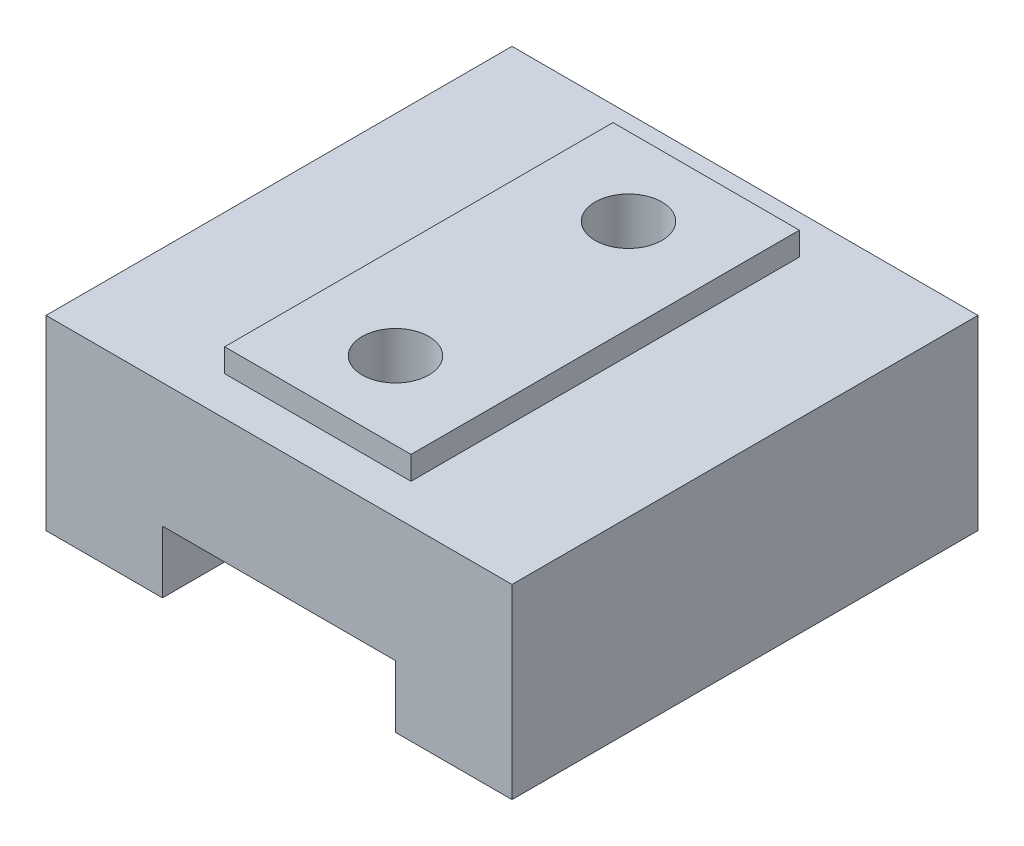
ISO-10303-21;
HEADER;
FILE_DESCRIPTION(('STEP AP214'),'2;1');
FILE_NAME('part.step','',(''),(''),'','','');
FILE_SCHEMA(('AUTOMOTIVE_DESIGN { 1 0 10303 214 1 1 1 1 }'));
ENDSEC;
DATA;
#1=APPLICATION_CONTEXT('core data for automotive mechanical design processes');
#2=APPLICATION_PROTOCOL_DEFINITION('international standard','automotive_design',2000,#1);
#3=PRODUCT_CONTEXT('',#1,'mechanical');
#4=PRODUCT('Part','Part','',(#3));
#5=PRODUCT_RELATED_PRODUCT_CATEGORY('part','',(#4));
#6=PRODUCT_DEFINITION_FORMATION('','',#4);
#7=PRODUCT_DEFINITION_CONTEXT('part definition',#1,'design');
#8=PRODUCT_DEFINITION('design','',#6,#7);
#9=PRODUCT_DEFINITION_SHAPE('','',#8);
#10=(LENGTH_UNIT() NAMED_UNIT(*) SI_UNIT(.MILLI.,.METRE.));
#11=(NAMED_UNIT(*) PLANE_ANGLE_UNIT() SI_UNIT($,.RADIAN.));
#12=(NAMED_UNIT(*) SI_UNIT($,.STERADIAN.) SOLID_ANGLE_UNIT());
#13=UNCERTAINTY_MEASURE_WITH_UNIT(LENGTH_MEASURE(1.E-05),#10,'distance_accuracy_value','');
#14=(GEOMETRIC_REPRESENTATION_CONTEXT(3) GLOBAL_UNCERTAINTY_ASSIGNED_CONTEXT((#13)) GLOBAL_UNIT_ASSIGNED_CONTEXT((#10,
#11,#12)) REPRESENTATION_CONTEXT('',''));
#15=CARTESIAN_POINT('',(0.,0.,0.));
#16=DIRECTION('',(0.,0.,1.));
#17=DIRECTION('',(1.,0.,0.));
#18=AXIS2_PLACEMENT_3D('',#15,#16,#17);
#19=CARTESIAN_POINT('',(0.,0.,0.));
#20=DIRECTION('',(0.,1.,0.));
#21=DIRECTION('',(0.,0.,1.));
#22=AXIS2_PLACEMENT_3D('',#19,#20,#21);
#23=PLANE('',#22);
#24=DIRECTION('',(0.,0.,-1.));
#25=VECTOR('',#24,1.);
#26=CARTESIAN_POINT('',(-7.5,0.,15.));
#27=LINE('',#26,#25);
#28=CARTESIAN_POINT('',(-7.5,0.,15.));
#29=VERTEX_POINT('',#28);
#30=CARTESIAN_POINT('',(-7.5,0.,-15.));
#31=VERTEX_POINT('',#30);
#32=EDGE_CURVE('E234',#29,#31,#27,.T.);
#33=ORIENTED_EDGE('',*,*,#32,.F.);
#34=DIRECTION('',(1.,0.,0.));
#35=VECTOR('',#34,1.);
#36=CARTESIAN_POINT('',(15.,0.,15.));
#37=LINE('',#36,#35);
#38=CARTESIAN_POINT('',(-15.,0.,15.));
#39=VERTEX_POINT('',#38);
#40=EDGE_CURVE('E212',#39,#29,#37,.T.);
#41=ORIENTED_EDGE('',*,*,#40,.F.);
#42=DIRECTION('',(0.,0.,1.));
#43=VECTOR('',#42,1.);
#44=CARTESIAN_POINT('',(-15.,0.,15.));
#45=LINE('',#44,#43);
#46=CARTESIAN_POINT('',(-15.,0.,-15.));
#47=VERTEX_POINT('',#46);
#48=EDGE_CURVE('E197',#47,#39,#45,.T.);
#49=ORIENTED_EDGE('',*,*,#48,.F.);
#50=DIRECTION('',(-1.,0.,0.));
#51=VECTOR('',#50,1.);
#52=CARTESIAN_POINT('',(15.,0.,-15.));
#53=LINE('',#52,#51);
#54=EDGE_CURVE('E216',#31,#47,#53,.T.);
#55=ORIENTED_EDGE('',*,*,#54,.F.);
#56=EDGE_LOOP('',(#33,#41,#49,#55));
#57=FACE_BOUND('',#56,.T.);
#58=ADVANCED_FACE('F39',(#57),#23,.F.);
#59=DIRECTION('',(0.,0.,1.));
#60=VECTOR('',#59,1.);
#61=CARTESIAN_POINT('',(7.5,0.,15.));
#62=LINE('',#61,#60);
#63=CARTESIAN_POINT('',(7.5,0.,-15.));
#64=VERTEX_POINT('',#63);
#65=CARTESIAN_POINT('',(7.5,0.,15.));
#66=VERTEX_POINT('',#65);
#67=EDGE_CURVE('E231',#64,#66,#62,.T.);
#68=ORIENTED_EDGE('',*,*,#67,.F.);
#69=CARTESIAN_POINT('',(15.,0.,-15.));
#70=VERTEX_POINT('',#69);
#71=EDGE_CURVE('E148',#70,#64,#53,.T.);
#72=ORIENTED_EDGE('',*,*,#71,.F.);
#73=DIRECTION('',(0.,0.,-1.));
#74=VECTOR('',#73,1.);
#75=CARTESIAN_POINT('',(15.,0.,15.));
#76=LINE('',#75,#74);
#77=CARTESIAN_POINT('',(15.,0.,15.));
#78=VERTEX_POINT('',#77);
#79=EDGE_CURVE('E211',#78,#70,#76,.T.);
#80=ORIENTED_EDGE('',*,*,#79,.F.);
#81=EDGE_CURVE('E208',#66,#78,#37,.T.);
#82=ORIENTED_EDGE('',*,*,#81,.F.);
#83=EDGE_LOOP('',(#68,#72,#80,#82));
#84=FACE_BOUND('',#83,.T.);
#85=ADVANCED_FACE('F235',(#84),#23,.F.);
#86=CARTESIAN_POINT('',(0.,0.,-7.5));
#87=DIRECTION('',(0.,1.,0.));
#88=DIRECTION('',(0.,0.,1.));
#89=AXIS2_PLACEMENT_3D('',#86,#87,#88);
#90=CYLINDRICAL_SURFACE('',#89,2.15);
#91=CARTESIAN_POINT('',(0.,13.5,-7.5));
#92=DIRECTION('',(0.,1.,0.));
#93=DIRECTION('',(0.,0.,1.));
#94=AXIS2_PLACEMENT_3D('',#91,#92,#93);
#95=CIRCLE('',#94,2.15);
#96=CARTESIAN_POINT('',(0.,13.5,-5.35));
#97=VERTEX_POINT('',#96);
#98=EDGE_CURVE('E163',#97,#97,#95,.T.);
#99=ORIENTED_EDGE('',*,*,#98,.T.);
#100=EDGE_LOOP('',(#99));
#101=FACE_BOUND('',#100,.T.);
#102=CARTESIAN_POINT('',(0.,4.,-7.5));
#103=DIRECTION('',(0.,-1.,0.));
#104=DIRECTION('',(0.,0.,-1.));
#105=AXIS2_PLACEMENT_3D('',#102,#103,#104);
#106=CIRCLE('',#105,2.15);
#107=CARTESIAN_POINT('',(0.,4.,-9.65));
#108=VERTEX_POINT('',#107);
#109=EDGE_CURVE('E160',#108,#108,#106,.F.);
#110=ORIENTED_EDGE('',*,*,#109,.F.);
#111=EDGE_LOOP('',(#110));
#112=FACE_BOUND('',#111,.T.);
#113=ADVANCED_FACE('F247',(#101,#112),#90,.F.);
#114=CARTESIAN_POINT('',(0.,0.,7.5));
#115=DIRECTION('',(0.,1.,0.));
#116=DIRECTION('',(0.,0.,1.));
#117=AXIS2_PLACEMENT_3D('',#114,#115,#116);
#118=CYLINDRICAL_SURFACE('',#117,2.15);
#119=CARTESIAN_POINT('',(0.,13.5,7.5));
#120=DIRECTION('',(0.,1.,0.));
#121=DIRECTION('',(0.,0.,1.));
#122=AXIS2_PLACEMENT_3D('',#119,#120,#121);
#123=CIRCLE('',#122,2.15);
#124=CARTESIAN_POINT('',(0.,13.5,9.65));
#125=VERTEX_POINT('',#124);
#126=EDGE_CURVE('E165',#125,#125,#123,.T.);
#127=ORIENTED_EDGE('',*,*,#126,.T.);
#128=EDGE_LOOP('',(#127));
#129=FACE_BOUND('',#128,.T.);
#130=CARTESIAN_POINT('',(0.,4.,7.5));
#131=DIRECTION('',(0.,-1.,0.));
#132=DIRECTION('',(0.,0.,-1.));
#133=AXIS2_PLACEMENT_3D('',#130,#131,#132);
#134=CIRCLE('',#133,2.15);
#135=CARTESIAN_POINT('',(0.,4.,5.35));
#136=VERTEX_POINT('',#135);
#137=EDGE_CURVE('E43',#136,#136,#134,.F.);
#138=ORIENTED_EDGE('',*,*,#137,.F.);
#139=EDGE_LOOP('',(#138));
#140=FACE_BOUND('',#139,.T.);
#141=ADVANCED_FACE('F246',(#129,#140),#118,.F.);
#142=CARTESIAN_POINT('',(-15.,12.,15.));
#143=DIRECTION('',(1.,0.,0.));
#144=DIRECTION('',(0.,0.,-1.));
#145=AXIS2_PLACEMENT_3D('',#142,#143,#144);
#146=PLANE('',#145);
#147=ORIENTED_EDGE('',*,*,#48,.T.);
#148=DIRECTION('',(0.,-1.,0.));
#149=VECTOR('',#148,1.);
#150=CARTESIAN_POINT('',(-15.,12.,15.));
#151=LINE('',#150,#149);
#152=CARTESIAN_POINT('',(-15.,12.,15.));
#153=VERTEX_POINT('',#152);
#154=EDGE_CURVE('E11',#153,#39,#151,.T.);
#155=ORIENTED_EDGE('',*,*,#154,.F.);
#156=DIRECTION('',(0.,0.,1.));
#157=VECTOR('',#156,1.);
#158=CARTESIAN_POINT('',(-15.,12.,15.));
#159=LINE('',#158,#157);
#160=CARTESIAN_POINT('',(-15.,12.,-15.));
#161=VERTEX_POINT('',#160);
#162=EDGE_CURVE('E199',#161,#153,#159,.T.);
#163=ORIENTED_EDGE('',*,*,#162,.F.);
#164=DIRECTION('',(0.,-1.,0.));
#165=VECTOR('',#164,1.);
#166=CARTESIAN_POINT('',(-15.,12.,-15.));
#167=LINE('',#166,#165);
#168=EDGE_CURVE('E210',#161,#47,#167,.T.);
#169=ORIENTED_EDGE('',*,*,#168,.T.);
#170=EDGE_LOOP('',(#147,#155,#163,#169));
#171=FACE_BOUND('',#170,.T.);
#172=ADVANCED_FACE('F41',(#171),#146,.F.);
#173=CARTESIAN_POINT('',(15.,12.,15.));
#174=DIRECTION('',(0.,0.,-1.));
#175=DIRECTION('',(-1.,0.,0.));
#176=AXIS2_PLACEMENT_3D('',#173,#174,#175);
#177=PLANE('',#176);
#178=DIRECTION('',(-1.,0.,0.));
#179=VECTOR('',#178,1.);
#180=CARTESIAN_POINT('',(-7.5,4.,15.));
#181=LINE('',#180,#179);
#182=CARTESIAN_POINT('',(7.5,4.,15.));
#183=VERTEX_POINT('',#182);
#184=CARTESIAN_POINT('',(-7.5,4.,15.));
#185=VERTEX_POINT('',#184);
#186=EDGE_CURVE('E136',#183,#185,#181,.T.);
#187=ORIENTED_EDGE('',*,*,#186,.F.);
#188=DIRECTION('',(0.,-1.,0.));
#189=VECTOR('',#188,1.);
#190=CARTESIAN_POINT('',(7.5,4.,15.));
#191=LINE('',#190,#189);
#192=EDGE_CURVE('E135',#183,#66,#191,.T.);
#193=ORIENTED_EDGE('',*,*,#192,.T.);
#194=ORIENTED_EDGE('',*,*,#81,.T.);
#195=DIRECTION('',(0.,-1.,0.));
#196=VECTOR('',#195,1.);
#197=CARTESIAN_POINT('',(15.,12.,15.));
#198=LINE('',#197,#196);
#199=CARTESIAN_POINT('',(15.,12.,15.));
#200=VERTEX_POINT('',#199);
#201=EDGE_CURVE('E48',#200,#78,#198,.T.);
#202=ORIENTED_EDGE('',*,*,#201,.F.);
#203=DIRECTION('',(1.,0.,0.));
#204=VECTOR('',#203,1.);
#205=CARTESIAN_POINT('',(15.,12.,15.));
#206=LINE('',#205,#204);
#207=EDGE_CURVE('E204',#153,#200,#206,.T.);
#208=ORIENTED_EDGE('',*,*,#207,.F.);
#209=ORIENTED_EDGE('',*,*,#154,.T.);
#210=ORIENTED_EDGE('',*,*,#40,.T.);
#211=DIRECTION('',(0.,-1.,0.));
#212=VECTOR('',#211,1.);
#213=CARTESIAN_POINT('',(-7.5,4.,15.));
#214=LINE('',#213,#212);
#215=EDGE_CURVE('E154',#185,#29,#214,.T.);
#216=ORIENTED_EDGE('',*,*,#215,.F.);
#217=EDGE_LOOP('',(#187,#193,#194,#202,#208,#209,#210,#216));
#218=FACE_BOUND('',#217,.T.);
#219=ADVANCED_FACE('F257',(#218),#177,.F.);
#220=CARTESIAN_POINT('',(15.,12.,15.));
#221=DIRECTION('',(-1.,0.,0.));
#222=DIRECTION('',(0.,0.,1.));
#223=AXIS2_PLACEMENT_3D('',#220,#221,#222);
#224=PLANE('',#223);
#225=ORIENTED_EDGE('',*,*,#79,.T.);
#226=DIRECTION('',(0.,-1.,0.));
#227=VECTOR('',#226,1.);
#228=CARTESIAN_POINT('',(15.,12.,-15.));
#229=LINE('',#228,#227);
#230=CARTESIAN_POINT('',(15.,12.,-15.));
#231=VERTEX_POINT('',#230);
#232=EDGE_CURVE('E220',#231,#70,#229,.T.);
#233=ORIENTED_EDGE('',*,*,#232,.F.);
#234=DIRECTION('',(0.,0.,-1.));
#235=VECTOR('',#234,1.);
#236=CARTESIAN_POINT('',(15.,12.,15.));
#237=LINE('',#236,#235);
#238=EDGE_CURVE('E205',#200,#231,#237,.T.);
#239=ORIENTED_EDGE('',*,*,#238,.F.);
#240=ORIENTED_EDGE('',*,*,#201,.T.);
#241=EDGE_LOOP('',(#225,#233,#239,#240));
#242=FACE_BOUND('',#241,.T.);
#243=ADVANCED_FACE('F227',(#242),#224,.F.);
#244=CARTESIAN_POINT('',(15.,12.,-15.));
#245=DIRECTION('',(0.,0.,1.));
#246=DIRECTION('',(1.,0.,0.));
#247=AXIS2_PLACEMENT_3D('',#244,#245,#246);
#248=PLANE('',#247);
#249=DIRECTION('',(1.,0.,0.));
#250=VECTOR('',#249,1.);
#251=CARTESIAN_POINT('',(-7.5,4.,-15.));
#252=LINE('',#251,#250);
#253=CARTESIAN_POINT('',(-7.5,4.,-15.));
#254=VERTEX_POINT('',#253);
#255=CARTESIAN_POINT('',(7.5,4.,-15.));
#256=VERTEX_POINT('',#255);
#257=EDGE_CURVE('E140',#254,#256,#252,.T.);
#258=ORIENTED_EDGE('',*,*,#257,.F.);
#259=DIRECTION('',(0.,-1.,0.));
#260=VECTOR('',#259,1.);
#261=CARTESIAN_POINT('',(-7.5,4.,-15.));
#262=LINE('',#261,#260);
#263=EDGE_CURVE('E151',#254,#31,#262,.T.);
#264=ORIENTED_EDGE('',*,*,#263,.T.);
#265=ORIENTED_EDGE('',*,*,#54,.T.);
#266=ORIENTED_EDGE('',*,*,#168,.F.);
#267=DIRECTION('',(-1.,0.,0.));
#268=VECTOR('',#267,1.);
#269=CARTESIAN_POINT('',(15.,12.,-15.));
#270=LINE('',#269,#268);
#271=EDGE_CURVE('E202',#231,#161,#270,.T.);
#272=ORIENTED_EDGE('',*,*,#271,.F.);
#273=ORIENTED_EDGE('',*,*,#232,.T.);
#274=ORIENTED_EDGE('',*,*,#71,.T.);
#275=DIRECTION('',(0.,-1.,0.));
#276=VECTOR('',#275,1.);
#277=CARTESIAN_POINT('',(7.5,4.,-15.));
#278=LINE('',#277,#276);
#279=EDGE_CURVE('E132',#256,#64,#278,.T.);
#280=ORIENTED_EDGE('',*,*,#279,.F.);
#281=EDGE_LOOP('',(#258,#264,#265,#266,#272,#273,#274,#280));
#282=FACE_BOUND('',#281,.T.);
#283=ADVANCED_FACE('F150',(#282),#248,.F.);
#284=CARTESIAN_POINT('',(0.,12.,0.));
#285=DIRECTION('',(0.,1.,0.));
#286=DIRECTION('',(0.,0.,1.));
#287=AXIS2_PLACEMENT_3D('',#284,#285,#286);
#288=PLANE('',#287);
#289=DIRECTION('',(0.,0.,-1.));
#290=VECTOR('',#289,1.);
#291=CARTESIAN_POINT('',(6.,12.,-12.5));
#292=LINE('',#291,#290);
#293=CARTESIAN_POINT('',(6.,12.,12.5));
#294=VERTEX_POINT('',#293);
#295=CARTESIAN_POINT('',(6.,12.,-12.5));
#296=VERTEX_POINT('',#295);
#297=EDGE_CURVE('E64',#294,#296,#292,.T.);
#298=ORIENTED_EDGE('',*,*,#297,.F.);
#299=DIRECTION('',(1.,0.,0.));
#300=VECTOR('',#299,1.);
#301=CARTESIAN_POINT('',(6.,12.,12.5));
#302=LINE('',#301,#300);
#303=CARTESIAN_POINT('',(-6.,12.,12.5));
#304=VERTEX_POINT('',#303);
#305=EDGE_CURVE('E171',#304,#294,#302,.T.);
#306=ORIENTED_EDGE('',*,*,#305,.F.);
#307=DIRECTION('',(0.,0.,1.));
#308=VECTOR('',#307,1.);
#309=CARTESIAN_POINT('',(-6.,12.,-12.5));
#310=LINE('',#309,#308);
#311=CARTESIAN_POINT('',(-6.,12.,-12.5));
#312=VERTEX_POINT('',#311);
#313=EDGE_CURVE('E185',#312,#304,#310,.T.);
#314=ORIENTED_EDGE('',*,*,#313,.F.);
#315=DIRECTION('',(-1.,0.,0.));
#316=VECTOR('',#315,1.);
#317=CARTESIAN_POINT('',(6.,12.,-12.5));
#318=LINE('',#317,#316);
#319=EDGE_CURVE('E177',#296,#312,#318,.T.);
#320=ORIENTED_EDGE('',*,*,#319,.F.);
#321=EDGE_LOOP('',(#298,#306,#314,#320));
#322=FACE_BOUND('',#321,.T.);
#323=ORIENTED_EDGE('',*,*,#162,.T.);
#324=ORIENTED_EDGE('',*,*,#207,.T.);
#325=ORIENTED_EDGE('',*,*,#238,.T.);
#326=ORIENTED_EDGE('',*,*,#271,.T.);
#327=EDGE_LOOP('',(#323,#324,#325,#326));
#328=FACE_BOUND('',#327,.T.);
#329=ADVANCED_FACE('F267',(#322,#328),#288,.T.);
#330=CARTESIAN_POINT('',(0.,13.5,0.));
#331=DIRECTION('',(0.,-1.,0.));
#332=DIRECTION('',(0.,0.,-1.));
#333=AXIS2_PLACEMENT_3D('',#330,#331,#332);
#334=PLANE('',#333);
#335=DIRECTION('',(0.,0.,-1.));
#336=VECTOR('',#335,1.);
#337=CARTESIAN_POINT('',(6.,13.5,-12.5));
#338=LINE('',#337,#336);
#339=CARTESIAN_POINT('',(6.,13.5,12.5));
#340=VERTEX_POINT('',#339);
#341=CARTESIAN_POINT('',(6.,13.5,-12.5));
#342=VERTEX_POINT('',#341);
#343=EDGE_CURVE('E170',#340,#342,#338,.T.);
#344=ORIENTED_EDGE('',*,*,#343,.T.);
#345=DIRECTION('',(-1.,0.,0.));
#346=VECTOR('',#345,1.);
#347=CARTESIAN_POINT('',(6.,13.5,-12.5));
#348=LINE('',#347,#346);
#349=CARTESIAN_POINT('',(-6.,13.5,-12.5));
#350=VERTEX_POINT('',#349);
#351=EDGE_CURVE('E167',#342,#350,#348,.T.);
#352=ORIENTED_EDGE('',*,*,#351,.T.);
#353=DIRECTION('',(0.,0.,1.));
#354=VECTOR('',#353,1.);
#355=CARTESIAN_POINT('',(-6.,13.5,-12.5));
#356=LINE('',#355,#354);
#357=CARTESIAN_POINT('',(-6.,13.5,12.5));
#358=VERTEX_POINT('',#357);
#359=EDGE_CURVE('E173',#350,#358,#356,.T.);
#360=ORIENTED_EDGE('',*,*,#359,.T.);
#361=DIRECTION('',(1.,0.,0.));
#362=VECTOR('',#361,1.);
#363=CARTESIAN_POINT('',(6.,13.5,12.5));
#364=LINE('',#363,#362);
#365=EDGE_CURVE('E174',#358,#340,#364,.T.);
#366=ORIENTED_EDGE('',*,*,#365,.T.);
#367=EDGE_LOOP('',(#344,#352,#360,#366));
#368=FACE_BOUND('',#367,.T.);
#369=ORIENTED_EDGE('',*,*,#126,.F.);
#370=EDGE_LOOP('',(#369));
#371=FACE_BOUND('',#370,.T.);
#372=ORIENTED_EDGE('',*,*,#98,.F.);
#373=EDGE_LOOP('',(#372));
#374=FACE_BOUND('',#373,.T.);
#375=ADVANCED_FACE('F285',(#368,#371,#374),#334,.F.);
#376=CARTESIAN_POINT('',(6.,13.5,-12.5));
#377=DIRECTION('',(-1.,0.,0.));
#378=DIRECTION('',(0.,0.,1.));
#379=AXIS2_PLACEMENT_3D('',#376,#377,#378);
#380=PLANE('',#379);
#381=ORIENTED_EDGE('',*,*,#297,.T.);
#382=DIRECTION('',(0.,-1.,0.));
#383=VECTOR('',#382,1.);
#384=CARTESIAN_POINT('',(6.,13.5,-12.5));
#385=LINE('',#384,#383);
#386=EDGE_CURVE('E191',#342,#296,#385,.T.);
#387=ORIENTED_EDGE('',*,*,#386,.F.);
#388=ORIENTED_EDGE('',*,*,#343,.F.);
#389=DIRECTION('',(0.,-1.,0.));
#390=VECTOR('',#389,1.);
#391=CARTESIAN_POINT('',(6.,13.5,12.5));
#392=LINE('',#391,#390);
#393=EDGE_CURVE('E180',#340,#294,#392,.T.);
#394=ORIENTED_EDGE('',*,*,#393,.T.);
#395=EDGE_LOOP('',(#381,#387,#388,#394));
#396=FACE_BOUND('',#395,.T.);
#397=ADVANCED_FACE('F288',(#396),#380,.F.);
#398=CARTESIAN_POINT('',(6.,13.5,-12.5));
#399=DIRECTION('',(0.,0.,1.));
#400=DIRECTION('',(1.,0.,0.));
#401=AXIS2_PLACEMENT_3D('',#398,#399,#400);
#402=PLANE('',#401);
#403=ORIENTED_EDGE('',*,*,#319,.T.);
#404=DIRECTION('',(0.,-1.,0.));
#405=VECTOR('',#404,1.);
#406=CARTESIAN_POINT('',(-6.,13.5,-12.5));
#407=LINE('',#406,#405);
#408=EDGE_CURVE('E192',#350,#312,#407,.T.);
#409=ORIENTED_EDGE('',*,*,#408,.F.);
#410=ORIENTED_EDGE('',*,*,#351,.F.);
#411=ORIENTED_EDGE('',*,*,#386,.T.);
#412=EDGE_LOOP('',(#403,#409,#410,#411));
#413=FACE_BOUND('',#412,.T.);
#414=ADVANCED_FACE('F294',(#413),#402,.F.);
#415=CARTESIAN_POINT('',(-6.,13.5,-12.5));
#416=DIRECTION('',(1.,0.,0.));
#417=DIRECTION('',(0.,0.,-1.));
#418=AXIS2_PLACEMENT_3D('',#415,#416,#417);
#419=PLANE('',#418);
#420=ORIENTED_EDGE('',*,*,#313,.T.);
#421=DIRECTION('',(0.,-1.,0.));
#422=VECTOR('',#421,1.);
#423=CARTESIAN_POINT('',(-6.,13.5,12.5));
#424=LINE('',#423,#422);
#425=EDGE_CURVE('E189',#358,#304,#424,.T.);
#426=ORIENTED_EDGE('',*,*,#425,.F.);
#427=ORIENTED_EDGE('',*,*,#359,.F.);
#428=ORIENTED_EDGE('',*,*,#408,.T.);
#429=EDGE_LOOP('',(#420,#426,#427,#428));
#430=FACE_BOUND('',#429,.T.);
#431=ADVANCED_FACE('F303',(#430),#419,.F.);
#432=CARTESIAN_POINT('',(6.,13.5,12.5));
#433=DIRECTION('',(0.,0.,-1.));
#434=DIRECTION('',(-1.,0.,0.));
#435=AXIS2_PLACEMENT_3D('',#432,#433,#434);
#436=PLANE('',#435);
#437=ORIENTED_EDGE('',*,*,#305,.T.);
#438=ORIENTED_EDGE('',*,*,#393,.F.);
#439=ORIENTED_EDGE('',*,*,#365,.F.);
#440=ORIENTED_EDGE('',*,*,#425,.T.);
#441=EDGE_LOOP('',(#437,#438,#439,#440));
#442=FACE_BOUND('',#441,.T.);
#443=ADVANCED_FACE('F301',(#442),#436,.F.);
#444=CARTESIAN_POINT('',(0.,4.,0.));
#445=DIRECTION('',(0.,-1.,0.));
#446=DIRECTION('',(0.,0.,-1.));
#447=AXIS2_PLACEMENT_3D('',#444,#445,#446);
#448=PLANE('',#447);
#449=DIRECTION('',(0.,0.,-1.));
#450=VECTOR('',#449,1.);
#451=CARTESIAN_POINT('',(-7.5,4.,15.));
#452=LINE('',#451,#450);
#453=EDGE_CURVE('E54',#185,#254,#452,.T.);
#454=ORIENTED_EDGE('',*,*,#453,.T.);
#455=ORIENTED_EDGE('',*,*,#257,.T.);
#456=DIRECTION('',(0.,0.,1.));
#457=VECTOR('',#456,1.);
#458=CARTESIAN_POINT('',(7.5,4.,15.));
#459=LINE('',#458,#457);
#460=EDGE_CURVE('E126',#256,#183,#459,.T.);
#461=ORIENTED_EDGE('',*,*,#460,.T.);
#462=ORIENTED_EDGE('',*,*,#186,.T.);
#463=EDGE_LOOP('',(#454,#455,#461,#462));
#464=FACE_BOUND('',#463,.T.);
#465=ORIENTED_EDGE('',*,*,#137,.T.);
#466=EDGE_LOOP('',(#465));
#467=FACE_BOUND('',#466,.T.);
#468=ORIENTED_EDGE('',*,*,#109,.T.);
#469=EDGE_LOOP('',(#468));
#470=FACE_BOUND('',#469,.T.);
#471=ADVANCED_FACE('F142',(#464,#467,#470),#448,.T.);
#472=CARTESIAN_POINT('',(-7.5,4.,15.));
#473=DIRECTION('',(-1.,0.,0.));
#474=DIRECTION('',(0.,0.,1.));
#475=AXIS2_PLACEMENT_3D('',#472,#473,#474);
#476=PLANE('',#475);
#477=ORIENTED_EDGE('',*,*,#32,.T.);
#478=ORIENTED_EDGE('',*,*,#263,.F.);
#479=ORIENTED_EDGE('',*,*,#453,.F.);
#480=ORIENTED_EDGE('',*,*,#215,.T.);
#481=EDGE_LOOP('',(#477,#478,#479,#480));
#482=FACE_BOUND('',#481,.T.);
#483=ADVANCED_FACE('F276',(#482),#476,.F.);
#484=CARTESIAN_POINT('',(7.5,4.,15.));
#485=DIRECTION('',(1.,0.,0.));
#486=DIRECTION('',(0.,0.,-1.));
#487=AXIS2_PLACEMENT_3D('',#484,#485,#486);
#488=PLANE('',#487);
#489=ORIENTED_EDGE('',*,*,#67,.T.);
#490=ORIENTED_EDGE('',*,*,#192,.F.);
#491=ORIENTED_EDGE('',*,*,#460,.F.);
#492=ORIENTED_EDGE('',*,*,#279,.T.);
#493=EDGE_LOOP('',(#489,#490,#491,#492));
#494=FACE_BOUND('',#493,.T.);
#495=ADVANCED_FACE('F128',(#494),#488,.F.);
#496=CLOSED_SHELL('',(#58,#85,#113,#141,#172,#219,#243,#283,#329,#375,#397,#414,#431,#443,#471,
#483,#495));
#497=MANIFOLD_SOLID_BREP('B2',#496);
#498=ADVANCED_BREP_SHAPE_REPRESENTATION('',(#18,#497),#14);
#499=SHAPE_DEFINITION_REPRESENTATION(#9,#498);
ENDSEC;
END-ISO-10303-21;
